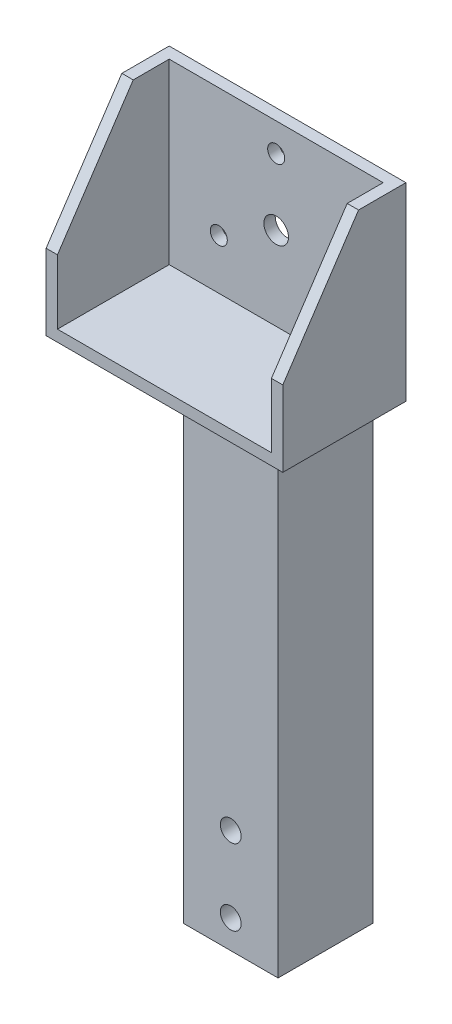
ISO-10303-21;
HEADER;
FILE_DESCRIPTION(('STEP AP214'),'2;1');
FILE_NAME('part.step','',(''),(''),'','','');
FILE_SCHEMA(('AUTOMOTIVE_DESIGN { 1 0 10303 214 1 1 1 1 }'));
ENDSEC;
DATA;
#1=APPLICATION_CONTEXT('core data for automotive mechanical design processes');
#2=APPLICATION_PROTOCOL_DEFINITION('international standard','automotive_design',2000,#1);
#3=PRODUCT_CONTEXT('',#1,'mechanical');
#4=PRODUCT('Part','Part','',(#3));
#5=PRODUCT_RELATED_PRODUCT_CATEGORY('part','',(#4));
#6=PRODUCT_DEFINITION_FORMATION('','',#4);
#7=PRODUCT_DEFINITION_CONTEXT('part definition',#1,'design');
#8=PRODUCT_DEFINITION('design','',#6,#7);
#9=PRODUCT_DEFINITION_SHAPE('','',#8);
#10=(LENGTH_UNIT() NAMED_UNIT(*) SI_UNIT(.MILLI.,.METRE.));
#11=(NAMED_UNIT(*) PLANE_ANGLE_UNIT() SI_UNIT($,.RADIAN.));
#12=(NAMED_UNIT(*) SI_UNIT($,.STERADIAN.) SOLID_ANGLE_UNIT());
#13=UNCERTAINTY_MEASURE_WITH_UNIT(LENGTH_MEASURE(1.E-05),#10,'distance_accuracy_value','');
#14=(GEOMETRIC_REPRESENTATION_CONTEXT(3) GLOBAL_UNCERTAINTY_ASSIGNED_CONTEXT((#13)) GLOBAL_UNIT_ASSIGNED_CONTEXT((#10,
#11,#12)) REPRESENTATION_CONTEXT('',''));
#15=CARTESIAN_POINT('',(0.,0.,0.));
#16=DIRECTION('',(0.,0.,1.));
#17=DIRECTION('',(1.,0.,0.));
#18=AXIS2_PLACEMENT_3D('',#15,#16,#17);
#19=CARTESIAN_POINT('',(0.,0.,65.));
#20=DIRECTION('',(0.,1.,0.));
#21=DIRECTION('',(0.,0.,1.));
#22=AXIS2_PLACEMENT_3D('',#19,#20,#21);
#23=PLANE('',#22);
#24=DIRECTION('',(1.,0.,0.));
#25=VECTOR('',#24,1.);
#26=CARTESIAN_POINT('',(0.,0.,0.));
#27=LINE('',#26,#25);
#28=CARTESIAN_POINT('',(0.,0.,0.));
#29=VERTEX_POINT('',#28);
#30=CARTESIAN_POINT('',(125.,0.,0.));
#31=VERTEX_POINT('',#30);
#32=EDGE_CURVE('E214',#29,#31,#27,.T.);
#33=ORIENTED_EDGE('',*,*,#32,.T.);
#34=DIRECTION('',(0.,0.,-1.));
#35=VECTOR('',#34,1.);
#36=CARTESIAN_POINT('',(125.,0.,65.));
#37=LINE('',#36,#35);
#38=CARTESIAN_POINT('',(125.,0.,65.));
#39=VERTEX_POINT('',#38);
#40=EDGE_CURVE('E224',#39,#31,#37,.T.);
#41=ORIENTED_EDGE('',*,*,#40,.F.);
#42=DIRECTION('',(1.,0.,0.));
#43=VECTOR('',#42,1.);
#44=CARTESIAN_POINT('',(0.,0.,65.));
#45=LINE('',#44,#43);
#46=CARTESIAN_POINT('',(0.,0.,65.));
#47=VERTEX_POINT('',#46);
#48=EDGE_CURVE('E205',#47,#39,#45,.T.);
#49=ORIENTED_EDGE('',*,*,#48,.F.);
#50=DIRECTION('',(0.,0.,-1.));
#51=VECTOR('',#50,1.);
#52=CARTESIAN_POINT('',(0.,0.,65.));
#53=LINE('',#52,#51);
#54=EDGE_CURVE('E41',#47,#29,#53,.T.);
#55=ORIENTED_EDGE('',*,*,#54,.T.);
#56=EDGE_LOOP('',(#33,#41,#49,#55));
#57=FACE_BOUND('',#56,.T.);
#58=DIRECTION('',(0.,0.,-1.));
#59=VECTOR('',#58,1.);
#60=CARTESIAN_POINT('',(65.,0.,57.5));
#61=LINE('',#60,#59);
#62=CARTESIAN_POINT('',(65.,0.,57.5));
#63=VERTEX_POINT('',#62);
#64=CARTESIAN_POINT('',(65.,0.,7.5));
#65=VERTEX_POINT('',#64);
#66=EDGE_CURVE('E154',#63,#65,#61,.T.);
#67=ORIENTED_EDGE('',*,*,#66,.F.);
#68=DIRECTION('',(-1.,0.,0.));
#69=VECTOR('',#68,1.);
#70=CARTESIAN_POINT('',(65.,0.,57.5));
#71=LINE('',#70,#69);
#72=CARTESIAN_POINT('',(115.,0.,57.5));
#73=VERTEX_POINT('',#72);
#74=EDGE_CURVE('E151',#73,#63,#71,.T.);
#75=ORIENTED_EDGE('',*,*,#74,.F.);
#76=DIRECTION('',(0.,0.,1.));
#77=VECTOR('',#76,1.);
#78=CARTESIAN_POINT('',(115.,0.,57.5));
#79=LINE('',#78,#77);
#80=CARTESIAN_POINT('',(115.,0.,7.5));
#81=VERTEX_POINT('',#80);
#82=EDGE_CURVE('E54',#81,#73,#79,.T.);
#83=ORIENTED_EDGE('',*,*,#82,.F.);
#84=DIRECTION('',(1.,0.,0.));
#85=VECTOR('',#84,1.);
#86=CARTESIAN_POINT('',(65.,0.,7.5));
#87=LINE('',#86,#85);
#88=EDGE_CURVE('E49',#65,#81,#87,.T.);
#89=ORIENTED_EDGE('',*,*,#88,.F.);
#90=EDGE_LOOP('',(#67,#75,#83,#89));
#91=FACE_BOUND('',#90,.T.);
#92=ADVANCED_FACE('F32',(#57,#91),#23,.F.);
#93=CARTESIAN_POINT('',(0.,100.,65.));
#94=DIRECTION('',(0.,0.,-1.));
#95=DIRECTION('',(-1.,0.,0.));
#96=AXIS2_PLACEMENT_3D('',#93,#94,#95);
#97=PLANE('',#96);
#98=DIRECTION('',(0.,1.,0.));
#99=VECTOR('',#98,1.);
#100=CARTESIAN_POINT('',(125.,0.,65.));
#101=LINE('',#100,#99);
#102=CARTESIAN_POINT('',(125.,40.,65.));
#103=VERTEX_POINT('',#102);
#104=EDGE_CURVE('E208',#39,#103,#101,.T.);
#105=ORIENTED_EDGE('',*,*,#104,.T.);
#106=DIRECTION('',(1.,0.,0.));
#107=VECTOR('',#106,1.);
#108=CARTESIAN_POINT('',(-72.1110255092798,40.,65.));
#109=LINE('',#108,#107);
#110=CARTESIAN_POINT('',(119.,40.,65.));
#111=VERTEX_POINT('',#110);
#112=EDGE_CURVE('E157',#111,#103,#109,.T.);
#113=ORIENTED_EDGE('',*,*,#112,.F.);
#114=DIRECTION('',(0.,1.,0.));
#115=VECTOR('',#114,1.);
#116=CARTESIAN_POINT('',(119.,100.,65.));
#117=LINE('',#116,#115);
#118=CARTESIAN_POINT('',(119.,6.,65.));
#119=VERTEX_POINT('',#118);
#120=EDGE_CURVE('E195',#119,#111,#117,.T.);
#121=ORIENTED_EDGE('',*,*,#120,.F.);
#122=DIRECTION('',(1.,0.,0.));
#123=VECTOR('',#122,1.);
#124=CARTESIAN_POINT('',(0.,6.00000000000001,65.));
#125=LINE('',#124,#123);
#126=CARTESIAN_POINT('',(6.,6.,65.));
#127=VERTEX_POINT('',#126);
#128=EDGE_CURVE('E192',#127,#119,#125,.T.);
#129=ORIENTED_EDGE('',*,*,#128,.F.);
#130=DIRECTION('',(0.,-1.,0.));
#131=VECTOR('',#130,1.);
#132=CARTESIAN_POINT('',(6.,100.,65.));
#133=LINE('',#132,#131);
#134=CARTESIAN_POINT('',(6.,40.0000000000001,65.));
#135=VERTEX_POINT('',#134);
#136=EDGE_CURVE('E190',#135,#127,#133,.T.);
#137=ORIENTED_EDGE('',*,*,#136,.F.);
#138=CARTESIAN_POINT('',(0.,40.,65.));
#139=VERTEX_POINT('',#138);
#140=EDGE_CURVE('E168',#139,#135,#109,.T.);
#141=ORIENTED_EDGE('',*,*,#140,.F.);
#142=DIRECTION('',(0.,-1.,0.));
#143=VECTOR('',#142,1.);
#144=CARTESIAN_POINT('',(0.,0.,65.));
#145=LINE('',#144,#143);
#146=EDGE_CURVE('E203',#139,#47,#145,.T.);
#147=ORIENTED_EDGE('',*,*,#146,.T.);
#148=ORIENTED_EDGE('',*,*,#48,.T.);
#149=EDGE_LOOP('',(#105,#113,#121,#129,#137,#141,#147,#148));
#150=FACE_BOUND('',#149,.T.);
#151=ADVANCED_FACE('F290',(#150),#97,.F.);
#152=CARTESIAN_POINT('',(0.,0.,65.));
#153=DIRECTION('',(1.,0.,0.));
#154=DIRECTION('',(0.,0.,-1.));
#155=AXIS2_PLACEMENT_3D('',#152,#153,#154);
#156=PLANE('',#155);
#157=ORIENTED_EDGE('',*,*,#146,.F.);
#158=DIRECTION('',(0.,-0.832050294337844,0.554700196225229));
#159=VECTOR('',#158,1.);
#160=CARTESIAN_POINT('',(0.,100.,25.));
#161=LINE('',#160,#159);
#162=CARTESIAN_POINT('',(0.,100.,25.));
#163=VERTEX_POINT('',#162);
#164=EDGE_CURVE('E166',#163,#139,#161,.T.);
#165=ORIENTED_EDGE('',*,*,#164,.F.);
#166=DIRECTION('',(0.,0.,-1.));
#167=VECTOR('',#166,1.);
#168=CARTESIAN_POINT('',(0.,100.,65.));
#169=LINE('',#168,#167);
#170=CARTESIAN_POINT('',(0.,100.,0.));
#171=VERTEX_POINT('',#170);
#172=EDGE_CURVE('E211',#163,#171,#169,.T.);
#173=ORIENTED_EDGE('',*,*,#172,.T.);
#174=DIRECTION('',(0.,-1.,0.));
#175=VECTOR('',#174,1.);
#176=CARTESIAN_POINT('',(0.,0.,0.));
#177=LINE('',#176,#175);
#178=EDGE_CURVE('E180',#171,#29,#177,.T.);
#179=ORIENTED_EDGE('',*,*,#178,.T.);
#180=ORIENTED_EDGE('',*,*,#54,.F.);
#181=EDGE_LOOP('',(#157,#165,#173,#179,#180));
#182=FACE_BOUND('',#181,.T.);
#183=ADVANCED_FACE('F34',(#182),#156,.F.);
#184=CARTESIAN_POINT('',(125.,0.,65.));
#185=DIRECTION('',(-1.,0.,0.));
#186=DIRECTION('',(0.,0.,1.));
#187=AXIS2_PLACEMENT_3D('',#184,#185,#186);
#188=PLANE('',#187);
#189=DIRECTION('',(0.,0.,-1.));
#190=VECTOR('',#189,1.);
#191=CARTESIAN_POINT('',(125.,100.,65.));
#192=LINE('',#191,#190);
#193=CARTESIAN_POINT('',(125.,100.,25.));
#194=VERTEX_POINT('',#193);
#195=CARTESIAN_POINT('',(125.,100.,0.));
#196=VERTEX_POINT('',#195);
#197=EDGE_CURVE('E222',#194,#196,#192,.T.);
#198=ORIENTED_EDGE('',*,*,#197,.F.);
#199=DIRECTION('',(0.,0.832050294337844,-0.554700196225229));
#200=VECTOR('',#199,1.);
#201=CARTESIAN_POINT('',(125.,100.,25.));
#202=LINE('',#201,#200);
#203=EDGE_CURVE('E155',#103,#194,#202,.T.);
#204=ORIENTED_EDGE('',*,*,#203,.F.);
#205=ORIENTED_EDGE('',*,*,#104,.F.);
#206=ORIENTED_EDGE('',*,*,#40,.T.);
#207=DIRECTION('',(0.,1.,0.));
#208=VECTOR('',#207,1.);
#209=CARTESIAN_POINT('',(125.,0.,0.));
#210=LINE('',#209,#208);
#211=EDGE_CURVE('E216',#31,#196,#210,.T.);
#212=ORIENTED_EDGE('',*,*,#211,.T.);
#213=EDGE_LOOP('',(#198,#204,#205,#206,#212));
#214=FACE_BOUND('',#213,.T.);
#215=ADVANCED_FACE('F298',(#214),#188,.F.);
#216=CARTESIAN_POINT('',(0.,100.,65.));
#217=DIRECTION('',(0.,-1.,0.));
#218=DIRECTION('',(0.,0.,-1.));
#219=AXIS2_PLACEMENT_3D('',#216,#217,#218);
#220=PLANE('',#219);
#221=ORIENTED_EDGE('',*,*,#172,.F.);
#222=DIRECTION('',(1.,0.,0.));
#223=VECTOR('',#222,1.);
#224=CARTESIAN_POINT('',(-72.1110255092798,100.,25.));
#225=LINE('',#224,#223);
#226=CARTESIAN_POINT('',(6.00000000000001,100.,25.));
#227=VERTEX_POINT('',#226);
#228=EDGE_CURVE('E163',#163,#227,#225,.T.);
#229=ORIENTED_EDGE('',*,*,#228,.T.);
#230=DIRECTION('',(0.,0.,-1.));
#231=VECTOR('',#230,1.);
#232=CARTESIAN_POINT('',(6.,100.,65.));
#233=LINE('',#232,#231);
#234=CARTESIAN_POINT('',(6.,100.,6.));
#235=VERTEX_POINT('',#234);
#236=EDGE_CURVE('E198',#227,#235,#233,.T.);
#237=ORIENTED_EDGE('',*,*,#236,.T.);
#238=DIRECTION('',(-1.,0.,0.));
#239=VECTOR('',#238,1.);
#240=CARTESIAN_POINT('',(0.,100.,6.));
#241=LINE('',#240,#239);
#242=CARTESIAN_POINT('',(119.,100.,6.));
#243=VERTEX_POINT('',#242);
#244=EDGE_CURVE('E189',#243,#235,#241,.T.);
#245=ORIENTED_EDGE('',*,*,#244,.F.);
#246=DIRECTION('',(0.,0.,-1.));
#247=VECTOR('',#246,1.);
#248=CARTESIAN_POINT('',(119.,100.,65.));
#249=LINE('',#248,#247);
#250=CARTESIAN_POINT('',(119.,100.,25.));
#251=VERTEX_POINT('',#250);
#252=EDGE_CURVE('E186',#251,#243,#249,.T.);
#253=ORIENTED_EDGE('',*,*,#252,.F.);
#254=EDGE_CURVE('E167',#251,#194,#225,.T.);
#255=ORIENTED_EDGE('',*,*,#254,.T.);
#256=ORIENTED_EDGE('',*,*,#197,.T.);
#257=DIRECTION('',(-1.,0.,0.));
#258=VECTOR('',#257,1.);
#259=CARTESIAN_POINT('',(0.,100.,0.));
#260=LINE('',#259,#258);
#261=EDGE_CURVE('E206',#196,#171,#260,.T.);
#262=ORIENTED_EDGE('',*,*,#261,.T.);
#263=EDGE_LOOP('',(#221,#229,#237,#245,#253,#255,#256,#262));
#264=FACE_BOUND('',#263,.T.);
#265=ADVANCED_FACE('F301',(#264),#220,.F.);
#266=CARTESIAN_POINT('',(0.,100.,0.));
#267=DIRECTION('',(0.,0.,-1.));
#268=DIRECTION('',(-1.,0.,0.));
#269=AXIS2_PLACEMENT_3D('',#266,#267,#268);
#270=PLANE('',#269);
#271=CARTESIAN_POINT('',(32.1891108675445,32.5000000000003,0.));
#272=DIRECTION('',(0.,0.,-1.));
#273=DIRECTION('',(0.499999999999992,-0.866025403784443,0.));
#274=AXIS2_PLACEMENT_3D('',#271,#272,#273);
#275=CIRCLE('',#274,4.5);
#276=CARTESIAN_POINT('',(34.4391108675444,28.6028856829703,0.));
#277=VERTEX_POINT('',#276);
#278=EDGE_CURVE('E249',#277,#277,#275,.T.);
#279=ORIENTED_EDGE('',*,*,#278,.F.);
#280=EDGE_LOOP('',(#279));
#281=FACE_BOUND('',#280,.T.);
#282=CARTESIAN_POINT('',(92.8108891324553,32.4999999999999,0.));
#283=DIRECTION('',(0.,0.,-1.));
#284=DIRECTION('',(0.500000000000004,0.866025403784436,0.));
#285=AXIS2_PLACEMENT_3D('',#282,#283,#284);
#286=CIRCLE('',#285,4.5);
#287=CARTESIAN_POINT('',(95.0608891324553,36.3971143170298,0.));
#288=VERTEX_POINT('',#287);
#289=EDGE_CURVE('E239',#288,#288,#286,.T.);
#290=ORIENTED_EDGE('',*,*,#289,.F.);
#291=EDGE_LOOP('',(#290));
#292=FACE_BOUND('',#291,.T.);
#293=CARTESIAN_POINT('',(62.5,85.,0.));
#294=DIRECTION('',(0.,0.,-1.));
#295=DIRECTION('',(-1.,0.,0.));
#296=AXIS2_PLACEMENT_3D('',#293,#294,#295);
#297=CIRCLE('',#296,4.5);
#298=CARTESIAN_POINT('',(58.,85.,0.));
#299=VERTEX_POINT('',#298);
#300=EDGE_CURVE('E236',#299,#299,#297,.T.);
#301=ORIENTED_EDGE('',*,*,#300,.F.);
#302=EDGE_LOOP('',(#301));
#303=FACE_BOUND('',#302,.T.);
#304=CARTESIAN_POINT('',(62.5,50.,0.));
#305=DIRECTION('',(0.,0.,-1.));
#306=DIRECTION('',(-1.,0.,0.));
#307=AXIS2_PLACEMENT_3D('',#304,#305,#306);
#308=CIRCLE('',#307,6.5);
#309=CARTESIAN_POINT('',(56.,50.,0.));
#310=VERTEX_POINT('',#309);
#311=EDGE_CURVE('E233',#310,#310,#308,.T.);
#312=ORIENTED_EDGE('',*,*,#311,.F.);
#313=EDGE_LOOP('',(#312));
#314=FACE_BOUND('',#313,.T.);
#315=ORIENTED_EDGE('',*,*,#178,.F.);
#316=ORIENTED_EDGE('',*,*,#261,.F.);
#317=ORIENTED_EDGE('',*,*,#211,.F.);
#318=ORIENTED_EDGE('',*,*,#32,.F.);
#319=EDGE_LOOP('',(#315,#316,#317,#318));
#320=FACE_BOUND('',#319,.T.);
#321=ADVANCED_FACE('F305',(#281,#292,#303,#314,#320),#270,.T.);
#322=CARTESIAN_POINT('',(6.,0.,65.));
#323=DIRECTION('',(1.,0.,0.));
#324=DIRECTION('',(0.,0.,-1.));
#325=AXIS2_PLACEMENT_3D('',#322,#323,#324);
#326=PLANE('',#325);
#327=DIRECTION('',(0.,0.832050294337844,-0.554700196225229));
#328=VECTOR('',#327,1.);
#329=CARTESIAN_POINT('',(6.,12.3076923076923,83.4615384615385));
#330=LINE('',#329,#328);
#331=EDGE_CURVE('E171',#135,#227,#330,.T.);
#332=ORIENTED_EDGE('',*,*,#331,.F.);
#333=ORIENTED_EDGE('',*,*,#136,.T.);
#334=DIRECTION('',(0.,0.,-1.));
#335=VECTOR('',#334,1.);
#336=CARTESIAN_POINT('',(6.,6.,65.));
#337=LINE('',#336,#335);
#338=CARTESIAN_POINT('',(6.,6.,6.));
#339=VERTEX_POINT('',#338);
#340=EDGE_CURVE('E177',#127,#339,#337,.T.);
#341=ORIENTED_EDGE('',*,*,#340,.T.);
#342=DIRECTION('',(0.,-1.,0.));
#343=VECTOR('',#342,1.);
#344=CARTESIAN_POINT('',(6.,100.,6.));
#345=LINE('',#344,#343);
#346=EDGE_CURVE('E173',#235,#339,#345,.T.);
#347=ORIENTED_EDGE('',*,*,#346,.F.);
#348=ORIENTED_EDGE('',*,*,#236,.F.);
#349=EDGE_LOOP('',(#332,#333,#341,#347,#348));
#350=FACE_BOUND('',#349,.T.);
#351=ADVANCED_FACE('F308',(#350),#326,.T.);
#352=CARTESIAN_POINT('',(0.,6.,65.));
#353=DIRECTION('',(0.,1.,0.));
#354=DIRECTION('',(0.,0.,1.));
#355=AXIS2_PLACEMENT_3D('',#352,#353,#354);
#356=PLANE('',#355);
#357=DIRECTION('',(1.,0.,0.));
#358=VECTOR('',#357,1.);
#359=CARTESIAN_POINT('',(0.,6.00000000000001,6.));
#360=LINE('',#359,#358);
#361=CARTESIAN_POINT('',(119.,6.,6.));
#362=VERTEX_POINT('',#361);
#363=EDGE_CURVE('E176',#339,#362,#360,.T.);
#364=ORIENTED_EDGE('',*,*,#363,.F.);
#365=ORIENTED_EDGE('',*,*,#340,.F.);
#366=ORIENTED_EDGE('',*,*,#128,.T.);
#367=DIRECTION('',(0.,0.,-1.));
#368=VECTOR('',#367,1.);
#369=CARTESIAN_POINT('',(119.,6.,65.));
#370=LINE('',#369,#368);
#371=EDGE_CURVE('E181',#119,#362,#370,.T.);
#372=ORIENTED_EDGE('',*,*,#371,.T.);
#373=EDGE_LOOP('',(#364,#365,#366,#372));
#374=FACE_BOUND('',#373,.T.);
#375=ADVANCED_FACE('F319',(#374),#356,.T.);
#376=CARTESIAN_POINT('',(119.,0.,65.));
#377=DIRECTION('',(-1.,0.,0.));
#378=DIRECTION('',(0.,0.,1.));
#379=AXIS2_PLACEMENT_3D('',#376,#377,#378);
#380=PLANE('',#379);
#381=DIRECTION('',(0.,-0.832050294337844,0.554700196225229));
#382=VECTOR('',#381,1.);
#383=CARTESIAN_POINT('',(119.,12.3076923076923,83.4615384615385));
#384=LINE('',#383,#382);
#385=EDGE_CURVE('E11',#251,#111,#384,.T.);
#386=ORIENTED_EDGE('',*,*,#385,.F.);
#387=ORIENTED_EDGE('',*,*,#252,.T.);
#388=DIRECTION('',(0.,1.,0.));
#389=VECTOR('',#388,1.);
#390=CARTESIAN_POINT('',(119.,100.,6.));
#391=LINE('',#390,#389);
#392=EDGE_CURVE('E183',#362,#243,#391,.T.);
#393=ORIENTED_EDGE('',*,*,#392,.F.);
#394=ORIENTED_EDGE('',*,*,#371,.F.);
#395=ORIENTED_EDGE('',*,*,#120,.T.);
#396=EDGE_LOOP('',(#386,#387,#393,#394,#395));
#397=FACE_BOUND('',#396,.T.);
#398=ADVANCED_FACE('F315',(#397),#380,.T.);
#399=CARTESIAN_POINT('',(0.,100.,6.));
#400=DIRECTION('',(0.,0.,-1.));
#401=DIRECTION('',(-1.,0.,0.));
#402=AXIS2_PLACEMENT_3D('',#399,#400,#401);
#403=PLANE('',#402);
#404=CARTESIAN_POINT('',(32.1891108675445,32.5000000000003,6.00000000000001));
#405=DIRECTION('',(0.,0.,-1.));
#406=DIRECTION('',(-1.,0.,0.));
#407=AXIS2_PLACEMENT_3D('',#404,#405,#406);
#408=CIRCLE('',#407,4.5);
#409=CARTESIAN_POINT('',(27.6891108675445,32.5000000000003,6.00000000000001));
#410=VERTEX_POINT('',#409);
#411=EDGE_CURVE('E36',#410,#410,#408,.T.);
#412=ORIENTED_EDGE('',*,*,#411,.T.);
#413=EDGE_LOOP('',(#412));
#414=FACE_BOUND('',#413,.T.);
#415=CARTESIAN_POINT('',(92.8108891324553,32.4999999999999,6.00000000000001));
#416=DIRECTION('',(0.,0.,-1.));
#417=DIRECTION('',(-1.,0.,0.));
#418=AXIS2_PLACEMENT_3D('',#415,#416,#417);
#419=CIRCLE('',#418,4.5);
#420=CARTESIAN_POINT('',(88.3108891324553,32.4999999999999,6.00000000000001));
#421=VERTEX_POINT('',#420);
#422=EDGE_CURVE('E237',#421,#421,#419,.T.);
#423=ORIENTED_EDGE('',*,*,#422,.T.);
#424=EDGE_LOOP('',(#423));
#425=FACE_BOUND('',#424,.T.);
#426=CARTESIAN_POINT('',(62.5,85.,6.00000000000001));
#427=DIRECTION('',(0.,0.,-1.));
#428=DIRECTION('',(-1.,0.,0.));
#429=AXIS2_PLACEMENT_3D('',#426,#427,#428);
#430=CIRCLE('',#429,4.5);
#431=CARTESIAN_POINT('',(58.,85.,6.00000000000001));
#432=VERTEX_POINT('',#431);
#433=EDGE_CURVE('E234',#432,#432,#430,.T.);
#434=ORIENTED_EDGE('',*,*,#433,.T.);
#435=EDGE_LOOP('',(#434));
#436=FACE_BOUND('',#435,.T.);
#437=CARTESIAN_POINT('',(62.5,50.,6.00000000000001));
#438=DIRECTION('',(0.,0.,-1.));
#439=DIRECTION('',(-1.,0.,0.));
#440=AXIS2_PLACEMENT_3D('',#437,#438,#439);
#441=CIRCLE('',#440,6.5);
#442=CARTESIAN_POINT('',(56.,50.,6.00000000000001));
#443=VERTEX_POINT('',#442);
#444=EDGE_CURVE('E229',#443,#443,#441,.T.);
#445=ORIENTED_EDGE('',*,*,#444,.T.);
#446=EDGE_LOOP('',(#445));
#447=FACE_BOUND('',#446,.T.);
#448=ORIENTED_EDGE('',*,*,#346,.T.);
#449=ORIENTED_EDGE('',*,*,#363,.T.);
#450=ORIENTED_EDGE('',*,*,#392,.T.);
#451=ORIENTED_EDGE('',*,*,#244,.T.);
#452=EDGE_LOOP('',(#448,#449,#450,#451));
#453=FACE_BOUND('',#452,.T.);
#454=ADVANCED_FACE('F311',(#414,#425,#436,#447,#453),#403,.F.);
#455=CARTESIAN_POINT('',(-72.1110255092798,100.,25.));
#456=DIRECTION('',(0.,-0.554700196225229,-0.832050294337844));
#457=DIRECTION('',(0.,0.832050294337844,-0.554700196225229));
#458=AXIS2_PLACEMENT_3D('',#455,#456,#457);
#459=PLANE('',#458);
#460=ORIENTED_EDGE('',*,*,#385,.T.);
#461=ORIENTED_EDGE('',*,*,#112,.T.);
#462=ORIENTED_EDGE('',*,*,#203,.T.);
#463=ORIENTED_EDGE('',*,*,#254,.F.);
#464=EDGE_LOOP('',(#460,#461,#462,#463));
#465=FACE_BOUND('',#464,.T.);
#466=ADVANCED_FACE('F314',(#465),#459,.F.);
#467=ORIENTED_EDGE('',*,*,#331,.T.);
#468=ORIENTED_EDGE('',*,*,#228,.F.);
#469=ORIENTED_EDGE('',*,*,#164,.T.);
#470=ORIENTED_EDGE('',*,*,#140,.T.);
#471=EDGE_LOOP('',(#467,#468,#469,#470));
#472=FACE_BOUND('',#471,.T.);
#473=ADVANCED_FACE('F329',(#472),#459,.F.);
#474=CARTESIAN_POINT('',(65.,-240.,57.5));
#475=DIRECTION('',(1.,0.,0.));
#476=DIRECTION('',(0.,0.,-1.));
#477=AXIS2_PLACEMENT_3D('',#474,#475,#476);
#478=PLANE('',#477);
#479=ORIENTED_EDGE('',*,*,#66,.T.);
#480=DIRECTION('',(0.,1.,0.));
#481=VECTOR('',#480,1.);
#482=CARTESIAN_POINT('',(65.,-240.,7.5));
#483=LINE('',#482,#481);
#484=CARTESIAN_POINT('',(65.,-240.,7.5));
#485=VERTEX_POINT('',#484);
#486=EDGE_CURVE('E135',#485,#65,#483,.T.);
#487=ORIENTED_EDGE('',*,*,#486,.F.);
#488=DIRECTION('',(0.,0.,-1.));
#489=VECTOR('',#488,1.);
#490=CARTESIAN_POINT('',(65.,-240.,57.5));
#491=LINE('',#490,#489);
#492=CARTESIAN_POINT('',(65.,-240.,57.5));
#493=VERTEX_POINT('',#492);
#494=EDGE_CURVE('E142',#493,#485,#491,.T.);
#495=ORIENTED_EDGE('',*,*,#494,.F.);
#496=DIRECTION('',(0.,1.,0.));
#497=VECTOR('',#496,1.);
#498=CARTESIAN_POINT('',(65.,-240.,57.5));
#499=LINE('',#498,#497);
#500=EDGE_CURVE('E267',#493,#63,#499,.T.);
#501=ORIENTED_EDGE('',*,*,#500,.T.);
#502=EDGE_LOOP('',(#479,#487,#495,#501));
#503=FACE_BOUND('',#502,.T.);
#504=ADVANCED_FACE('F153',(#503),#478,.F.);
#505=CARTESIAN_POINT('',(65.,-240.,7.5));
#506=DIRECTION('',(0.,0.,1.));
#507=DIRECTION('',(1.,0.,0.));
#508=AXIS2_PLACEMENT_3D('',#505,#506,#507);
#509=PLANE('',#508);
#510=CARTESIAN_POINT('',(90.,-185.,7.50000000000001));
#511=DIRECTION('',(0.,0.,1.));
#512=DIRECTION('',(1.,0.,0.));
#513=AXIS2_PLACEMENT_3D('',#510,#511,#512);
#514=CIRCLE('',#513,5.5);
#515=CARTESIAN_POINT('',(95.5,-185.,7.50000000000001));
#516=VERTEX_POINT('',#515);
#517=EDGE_CURVE('E256',#516,#516,#514,.T.);
#518=ORIENTED_EDGE('',*,*,#517,.T.);
#519=EDGE_LOOP('',(#518));
#520=FACE_BOUND('',#519,.T.);
#521=CARTESIAN_POINT('',(90.,-225.,7.50000000000001));
#522=DIRECTION('',(0.,0.,1.));
#523=DIRECTION('',(1.,0.,0.));
#524=AXIS2_PLACEMENT_3D('',#521,#522,#523);
#525=CIRCLE('',#524,5.5);
#526=CARTESIAN_POINT('',(95.5,-225.,7.50000000000001));
#527=VERTEX_POINT('',#526);
#528=EDGE_CURVE('E262',#527,#527,#525,.T.);
#529=ORIENTED_EDGE('',*,*,#528,.T.);
#530=EDGE_LOOP('',(#529));
#531=FACE_BOUND('',#530,.T.);
#532=ORIENTED_EDGE('',*,*,#88,.T.);
#533=DIRECTION('',(0.,1.,0.));
#534=VECTOR('',#533,1.);
#535=CARTESIAN_POINT('',(115.,-240.,7.5));
#536=LINE('',#535,#534);
#537=CARTESIAN_POINT('',(115.,-240.,7.5));
#538=VERTEX_POINT('',#537);
#539=EDGE_CURVE('E138',#538,#81,#536,.T.);
#540=ORIENTED_EDGE('',*,*,#539,.F.);
#541=DIRECTION('',(1.,0.,0.));
#542=VECTOR('',#541,1.);
#543=CARTESIAN_POINT('',(65.,-240.,7.5));
#544=LINE('',#543,#542);
#545=EDGE_CURVE('E131',#485,#538,#544,.T.);
#546=ORIENTED_EDGE('',*,*,#545,.F.);
#547=ORIENTED_EDGE('',*,*,#486,.T.);
#548=EDGE_LOOP('',(#532,#540,#546,#547));
#549=FACE_BOUND('',#548,.T.);
#550=ADVANCED_FACE('F133',(#520,#531,#549),#509,.F.);
#551=CARTESIAN_POINT('',(115.,-240.,57.5));
#552=DIRECTION('',(-1.,0.,0.));
#553=DIRECTION('',(0.,0.,1.));
#554=AXIS2_PLACEMENT_3D('',#551,#552,#553);
#555=PLANE('',#554);
#556=ORIENTED_EDGE('',*,*,#82,.T.);
#557=DIRECTION('',(0.,1.,0.));
#558=VECTOR('',#557,1.);
#559=CARTESIAN_POINT('',(115.,-240.,57.5));
#560=LINE('',#559,#558);
#561=CARTESIAN_POINT('',(115.,-240.,57.5));
#562=VERTEX_POINT('',#561);
#563=EDGE_CURVE('E159',#562,#73,#560,.T.);
#564=ORIENTED_EDGE('',*,*,#563,.F.);
#565=DIRECTION('',(0.,0.,1.));
#566=VECTOR('',#565,1.);
#567=CARTESIAN_POINT('',(115.,-240.,57.5));
#568=LINE('',#567,#566);
#569=EDGE_CURVE('E141',#538,#562,#568,.T.);
#570=ORIENTED_EDGE('',*,*,#569,.F.);
#571=ORIENTED_EDGE('',*,*,#539,.T.);
#572=EDGE_LOOP('',(#556,#564,#570,#571));
#573=FACE_BOUND('',#572,.T.);
#574=ADVANCED_FACE('F278',(#573),#555,.F.);
#575=CARTESIAN_POINT('',(65.,-240.,57.5));
#576=DIRECTION('',(0.,0.,-1.));
#577=DIRECTION('',(-1.,0.,0.));
#578=AXIS2_PLACEMENT_3D('',#575,#576,#577);
#579=PLANE('',#578);
#580=CARTESIAN_POINT('',(90.,-185.,57.5));
#581=DIRECTION('',(0.,0.,1.));
#582=DIRECTION('',(1.,0.,0.));
#583=AXIS2_PLACEMENT_3D('',#580,#581,#582);
#584=CIRCLE('',#583,5.5);
#585=CARTESIAN_POINT('',(95.5,-185.,57.5));
#586=VERTEX_POINT('',#585);
#587=EDGE_CURVE('E232',#586,#586,#584,.T.);
#588=ORIENTED_EDGE('',*,*,#587,.F.);
#589=EDGE_LOOP('',(#588));
#590=FACE_BOUND('',#589,.T.);
#591=CARTESIAN_POINT('',(90.,-225.,57.5));
#592=DIRECTION('',(0.,0.,1.));
#593=DIRECTION('',(1.,0.,0.));
#594=AXIS2_PLACEMENT_3D('',#591,#592,#593);
#595=CIRCLE('',#594,5.5);
#596=CARTESIAN_POINT('',(95.5,-225.,57.5));
#597=VERTEX_POINT('',#596);
#598=EDGE_CURVE('E259',#597,#597,#595,.T.);
#599=ORIENTED_EDGE('',*,*,#598,.F.);
#600=EDGE_LOOP('',(#599));
#601=FACE_BOUND('',#600,.T.);
#602=ORIENTED_EDGE('',*,*,#74,.T.);
#603=ORIENTED_EDGE('',*,*,#500,.F.);
#604=DIRECTION('',(-1.,0.,0.));
#605=VECTOR('',#604,1.);
#606=CARTESIAN_POINT('',(65.,-240.,57.5));
#607=LINE('',#606,#605);
#608=EDGE_CURVE('E147',#562,#493,#607,.T.);
#609=ORIENTED_EDGE('',*,*,#608,.F.);
#610=ORIENTED_EDGE('',*,*,#563,.T.);
#611=EDGE_LOOP('',(#602,#603,#609,#610));
#612=FACE_BOUND('',#611,.T.);
#613=ADVANCED_FACE('F276',(#590,#601,#612),#579,.F.);
#614=CARTESIAN_POINT('',(65.,-240.,7.5));
#615=DIRECTION('',(0.,-1.,0.));
#616=DIRECTION('',(0.,0.,-1.));
#617=AXIS2_PLACEMENT_3D('',#614,#615,#616);
#618=PLANE('',#617);
#619=ORIENTED_EDGE('',*,*,#494,.T.);
#620=ORIENTED_EDGE('',*,*,#545,.T.);
#621=ORIENTED_EDGE('',*,*,#569,.T.);
#622=ORIENTED_EDGE('',*,*,#608,.T.);
#623=EDGE_LOOP('',(#619,#620,#621,#622));
#624=FACE_BOUND('',#623,.T.);
#625=ADVANCED_FACE('F145',(#624),#618,.T.);
#626=CARTESIAN_POINT('',(90.,-225.,-182.5));
#627=DIRECTION('',(0.,0.,1.));
#628=DIRECTION('',(1.,0.,0.));
#629=AXIS2_PLACEMENT_3D('',#626,#627,#628);
#630=CYLINDRICAL_SURFACE('',#629,5.5);
#631=ORIENTED_EDGE('',*,*,#598,.T.);
#632=EDGE_LOOP('',(#631));
#633=FACE_BOUND('',#632,.T.);
#634=ORIENTED_EDGE('',*,*,#528,.F.);
#635=EDGE_LOOP('',(#634));
#636=FACE_BOUND('',#635,.T.);
#637=ADVANCED_FACE('F433',(#633,#636),#630,.F.);
#638=CARTESIAN_POINT('',(90.,-185.,-182.5));
#639=DIRECTION('',(0.,0.,1.));
#640=DIRECTION('',(1.,0.,0.));
#641=AXIS2_PLACEMENT_3D('',#638,#639,#640);
#642=CYLINDRICAL_SURFACE('',#641,5.5);
#643=ORIENTED_EDGE('',*,*,#587,.T.);
#644=EDGE_LOOP('',(#643));
#645=FACE_BOUND('',#644,.T.);
#646=ORIENTED_EDGE('',*,*,#517,.F.);
#647=EDGE_LOOP('',(#646));
#648=FACE_BOUND('',#647,.T.);
#649=ADVANCED_FACE('F452',(#645,#648),#642,.F.);
#650=CARTESIAN_POINT('',(62.5,50.,240.));
#651=DIRECTION('',(0.,0.,-1.));
#652=DIRECTION('',(-1.,0.,0.));
#653=AXIS2_PLACEMENT_3D('',#650,#651,#652);
#654=CYLINDRICAL_SURFACE('',#653,6.5);
#655=ORIENTED_EDGE('',*,*,#311,.T.);
#656=EDGE_LOOP('',(#655));
#657=FACE_BOUND('',#656,.T.);
#658=ORIENTED_EDGE('',*,*,#444,.F.);
#659=EDGE_LOOP('',(#658));
#660=FACE_BOUND('',#659,.T.);
#661=ADVANCED_FACE('F462',(#657,#660),#654,.F.);
#662=CARTESIAN_POINT('',(62.5,85.,240.));
#663=DIRECTION('',(0.,0.,-1.));
#664=DIRECTION('',(-1.,0.,0.));
#665=AXIS2_PLACEMENT_3D('',#662,#663,#664);
#666=CYLINDRICAL_SURFACE('',#665,4.5);
#667=ORIENTED_EDGE('',*,*,#300,.T.);
#668=EDGE_LOOP('',(#667));
#669=FACE_BOUND('',#668,.T.);
#670=ORIENTED_EDGE('',*,*,#433,.F.);
#671=EDGE_LOOP('',(#670));
#672=FACE_BOUND('',#671,.T.);
#673=ADVANCED_FACE('F471',(#669,#672),#666,.F.);
#674=CARTESIAN_POINT('',(92.8108891324553,32.4999999999999,240.));
#675=DIRECTION('',(0.,0.,-1.));
#676=DIRECTION('',(-1.,0.,0.));
#677=AXIS2_PLACEMENT_3D('',#674,#675,#676);
#678=CYLINDRICAL_SURFACE('',#677,4.5);
#679=ORIENTED_EDGE('',*,*,#289,.T.);
#680=EDGE_LOOP('',(#679));
#681=FACE_BOUND('',#680,.T.);
#682=ORIENTED_EDGE('',*,*,#422,.F.);
#683=EDGE_LOOP('',(#682));
#684=FACE_BOUND('',#683,.T.);
#685=ADVANCED_FACE('F480',(#681,#684),#678,.F.);
#686=CARTESIAN_POINT('',(32.1891108675445,32.5000000000003,240.));
#687=DIRECTION('',(0.,0.,-1.));
#688=DIRECTION('',(-1.,0.,0.));
#689=AXIS2_PLACEMENT_3D('',#686,#687,#688);
#690=CYLINDRICAL_SURFACE('',#689,4.5);
#691=ORIENTED_EDGE('',*,*,#278,.T.);
#692=EDGE_LOOP('',(#691));
#693=FACE_BOUND('',#692,.T.);
#694=ORIENTED_EDGE('',*,*,#411,.F.);
#695=EDGE_LOOP('',(#694));
#696=FACE_BOUND('',#695,.T.);
#697=ADVANCED_FACE('F490',(#693,#696),#690,.F.);
#698=CLOSED_SHELL('',(#92,#151,#183,#215,#265,#321,#351,#375,#398,#454,#466,#473,#504,#550,#574,
#613,#625,#637,#649,#661,#673,#685,#697));
#699=MANIFOLD_SOLID_BREP('B2',#698);
#700=ADVANCED_BREP_SHAPE_REPRESENTATION('',(#18,#699),#14);
#701=SHAPE_DEFINITION_REPRESENTATION(#9,#700);
ENDSEC;
END-ISO-10303-21;
